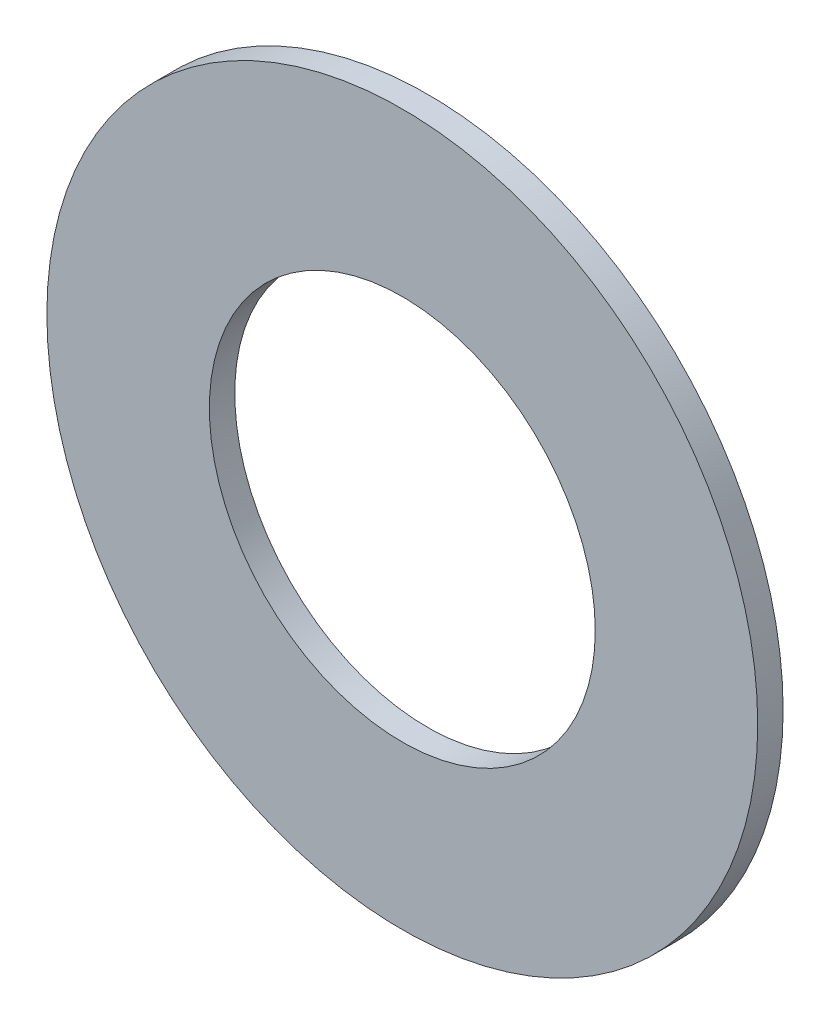
ISO-10303-21;
HEADER;
FILE_DESCRIPTION(('STEP AP214'),'2;1');
FILE_NAME('part.step','',(''),(''),'','','');
FILE_SCHEMA(('AUTOMOTIVE_DESIGN { 1 0 10303 214 1 1 1 1 }'));
ENDSEC;
DATA;
#1=APPLICATION_CONTEXT('core data for automotive mechanical design processes');
#2=APPLICATION_PROTOCOL_DEFINITION('international standard','automotive_design',2000,#1);
#3=PRODUCT_CONTEXT('',#1,'mechanical');
#4=PRODUCT('Part','Part','',(#3));
#5=PRODUCT_RELATED_PRODUCT_CATEGORY('part','',(#4));
#6=PRODUCT_DEFINITION_FORMATION('','',#4);
#7=PRODUCT_DEFINITION_CONTEXT('part definition',#1,'design');
#8=PRODUCT_DEFINITION('design','',#6,#7);
#9=PRODUCT_DEFINITION_SHAPE('','',#8);
#10=(LENGTH_UNIT() NAMED_UNIT(*) SI_UNIT(.MILLI.,.METRE.));
#11=(NAMED_UNIT(*) PLANE_ANGLE_UNIT() SI_UNIT($,.RADIAN.));
#12=(NAMED_UNIT(*) SI_UNIT($,.STERADIAN.) SOLID_ANGLE_UNIT());
#13=UNCERTAINTY_MEASURE_WITH_UNIT(LENGTH_MEASURE(1.E-05),#10,'distance_accuracy_value','');
#14=(GEOMETRIC_REPRESENTATION_CONTEXT(3) GLOBAL_UNCERTAINTY_ASSIGNED_CONTEXT((#13)) GLOBAL_UNIT_ASSIGNED_CONTEXT((#10,
#11,#12)) REPRESENTATION_CONTEXT('',''));
#15=CARTESIAN_POINT('',(0.,0.,0.));
#16=DIRECTION('',(0.,0.,1.));
#17=DIRECTION('',(1.,0.,0.));
#18=AXIS2_PLACEMENT_3D('',#15,#16,#17);
#19=CARTESIAN_POINT('',(0.,0.,1.));
#20=DIRECTION('',(0.,0.,1.));
#21=DIRECTION('',(1.,0.,0.));
#22=AXIS2_PLACEMENT_3D('',#19,#20,#21);
#23=PLANE('',#22);
#24=CARTESIAN_POINT('',(0.,0.,1.));
#25=DIRECTION('',(0.,0.,1.));
#26=DIRECTION('',(1.,0.,0.));
#27=AXIS2_PLACEMENT_3D('',#24,#25,#26);
#28=CIRCLE('',#27,14.);
#29=CARTESIAN_POINT('',(14.,0.,1.));
#30=VERTEX_POINT('',#29);
#31=EDGE_CURVE('E10',#30,#30,#28,.T.);
#32=ORIENTED_EDGE('',*,*,#31,.T.);
#33=EDGE_LOOP('',(#32));
#34=FACE_BOUND('',#33,.T.);
#35=CARTESIAN_POINT('',(0.,0.,1.));
#36=DIRECTION('',(0.,0.,1.));
#37=DIRECTION('',(1.,0.,0.));
#38=AXIS2_PLACEMENT_3D('',#35,#36,#37);
#39=CIRCLE('',#38,7.6);
#40=CARTESIAN_POINT('',(7.6,0.,1.));
#41=VERTEX_POINT('',#40);
#42=EDGE_CURVE('E48',#41,#41,#39,.T.);
#43=ORIENTED_EDGE('',*,*,#42,.F.);
#44=EDGE_LOOP('',(#43));
#45=FACE_BOUND('',#44,.T.);
#46=ADVANCED_FACE('F37',(#34,#45),#23,.T.);
#47=CARTESIAN_POINT('',(0.,0.,0.));
#48=DIRECTION('',(0.,0.,1.));
#49=DIRECTION('',(1.,0.,0.));
#50=AXIS2_PLACEMENT_3D('',#47,#48,#49);
#51=PLANE('',#50);
#52=CARTESIAN_POINT('',(0.,0.,0.));
#53=DIRECTION('',(0.,0.,1.));
#54=DIRECTION('',(1.,0.,0.));
#55=AXIS2_PLACEMENT_3D('',#52,#53,#54);
#56=CIRCLE('',#55,14.);
#57=CARTESIAN_POINT('',(14.,0.,0.));
#58=VERTEX_POINT('',#57);
#59=EDGE_CURVE('E41',#58,#58,#56,.T.);
#60=ORIENTED_EDGE('',*,*,#59,.F.);
#61=EDGE_LOOP('',(#60));
#62=FACE_BOUND('',#61,.T.);
#63=CARTESIAN_POINT('',(0.,0.,0.));
#64=DIRECTION('',(0.,0.,1.));
#65=DIRECTION('',(1.,0.,0.));
#66=AXIS2_PLACEMENT_3D('',#63,#64,#65);
#67=CIRCLE('',#66,7.6);
#68=CARTESIAN_POINT('',(7.6,0.,0.));
#69=VERTEX_POINT('',#68);
#70=EDGE_CURVE('E50',#69,#69,#67,.T.);
#71=ORIENTED_EDGE('',*,*,#70,.T.);
#72=EDGE_LOOP('',(#71));
#73=FACE_BOUND('',#72,.T.);
#74=ADVANCED_FACE('F60',(#62,#73),#51,.F.);
#75=CARTESIAN_POINT('',(0.,0.,1.));
#76=DIRECTION('',(0.,0.,-1.));
#77=DIRECTION('',(-1.,0.,0.));
#78=AXIS2_PLACEMENT_3D('',#75,#76,#77);
#79=CYLINDRICAL_SURFACE('',#78,14.);
#80=ORIENTED_EDGE('',*,*,#31,.F.);
#81=EDGE_LOOP('',(#80));
#82=FACE_BOUND('',#81,.T.);
#83=ORIENTED_EDGE('',*,*,#59,.T.);
#84=EDGE_LOOP('',(#83));
#85=FACE_BOUND('',#84,.T.);
#86=ADVANCED_FACE('F39',(#82,#85),#79,.T.);
#87=CARTESIAN_POINT('',(0.,0.,1.));
#88=DIRECTION('',(0.,0.,-1.));
#89=DIRECTION('',(-1.,0.,0.));
#90=AXIS2_PLACEMENT_3D('',#87,#88,#89);
#91=CYLINDRICAL_SURFACE('',#90,7.6);
#92=ORIENTED_EDGE('',*,*,#42,.T.);
#93=EDGE_LOOP('',(#92));
#94=FACE_BOUND('',#93,.T.);
#95=ORIENTED_EDGE('',*,*,#70,.F.);
#96=EDGE_LOOP('',(#95));
#97=FACE_BOUND('',#96,.T.);
#98=ADVANCED_FACE('F56',(#94,#97),#91,.F.);
#99=CLOSED_SHELL('',(#46,#74,#86,#98));
#100=MANIFOLD_SOLID_BREP('B2',#99);
#101=ADVANCED_BREP_SHAPE_REPRESENTATION('',(#18,#100),#14);
#102=SHAPE_DEFINITION_REPRESENTATION(#9,#101);
ENDSEC;
END-ISO-10303-21;
